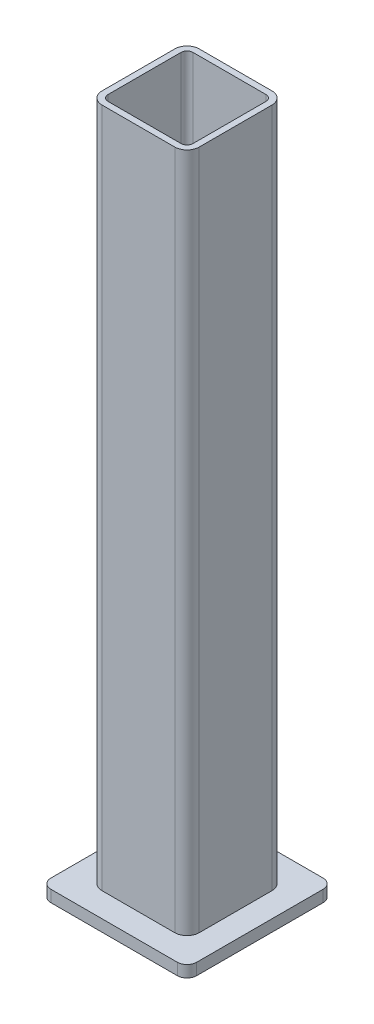
ISO-10303-21;
HEADER;
FILE_DESCRIPTION(('STEP AP214'),'2;1');
FILE_NAME('part.step','',(''),(''),'','','');
FILE_SCHEMA(('AUTOMOTIVE_DESIGN { 1 0 10303 214 1 1 1 1 }'));
ENDSEC;
DATA;
#1=APPLICATION_CONTEXT('core data for automotive mechanical design processes');
#2=APPLICATION_PROTOCOL_DEFINITION('international standard','automotive_design',2000,#1);
#3=PRODUCT_CONTEXT('',#1,'mechanical');
#4=PRODUCT('Part','Part','',(#3));
#5=PRODUCT_RELATED_PRODUCT_CATEGORY('part','',(#4));
#6=PRODUCT_DEFINITION_FORMATION('','',#4);
#7=PRODUCT_DEFINITION_CONTEXT('part definition',#1,'design');
#8=PRODUCT_DEFINITION('design','',#6,#7);
#9=PRODUCT_DEFINITION_SHAPE('','',#8);
#10=(LENGTH_UNIT() NAMED_UNIT(*) SI_UNIT(.MILLI.,.METRE.));
#11=(NAMED_UNIT(*) PLANE_ANGLE_UNIT() SI_UNIT($,.RADIAN.));
#12=(NAMED_UNIT(*) SI_UNIT($,.STERADIAN.) SOLID_ANGLE_UNIT());
#13=UNCERTAINTY_MEASURE_WITH_UNIT(LENGTH_MEASURE(1.E-05),#10,'distance_accuracy_value','');
#14=(GEOMETRIC_REPRESENTATION_CONTEXT(3) GLOBAL_UNCERTAINTY_ASSIGNED_CONTEXT((#13)) GLOBAL_UNIT_ASSIGNED_CONTEXT((#10,
#11,#12)) REPRESENTATION_CONTEXT('',''));
#15=CARTESIAN_POINT('',(0.,0.,0.));
#16=DIRECTION('',(0.,0.,1.));
#17=DIRECTION('',(1.,0.,0.));
#18=AXIS2_PLACEMENT_3D('',#15,#16,#17);
#19=CARTESIAN_POINT('',(75.,-12.,75.));
#20=DIRECTION('',(-1.,0.,0.));
#21=DIRECTION('',(0.,0.,1.));
#22=AXIS2_PLACEMENT_3D('',#19,#20,#21);
#23=PLANE('',#22);
#24=DIRECTION('',(0.,0.,1.));
#25=VECTOR('',#24,1.);
#26=CARTESIAN_POINT('',(75.,-12.,75.));
#27=LINE('',#26,#25);
#28=CARTESIAN_POINT('',(75.,-12.,-65.));
#29=VERTEX_POINT('',#28);
#30=CARTESIAN_POINT('',(75.,-12.,65.));
#31=VERTEX_POINT('',#30);
#32=EDGE_CURVE('E166',#29,#31,#27,.T.);
#33=ORIENTED_EDGE('',*,*,#32,.F.);
#34=DIRECTION('',(0.,1.,0.));
#35=VECTOR('',#34,1.);
#36=CARTESIAN_POINT('',(75.,-12.,-65.));
#37=LINE('',#36,#35);
#38=CARTESIAN_POINT('',(75.,0.,-65.));
#39=VERTEX_POINT('',#38);
#40=EDGE_CURVE('E192',#29,#39,#37,.T.);
#41=ORIENTED_EDGE('',*,*,#40,.T.);
#42=DIRECTION('',(0.,0.,1.));
#43=VECTOR('',#42,1.);
#44=CARTESIAN_POINT('',(75.,0.,75.));
#45=LINE('',#44,#43);
#46=CARTESIAN_POINT('',(75.,0.,65.));
#47=VERTEX_POINT('',#46);
#48=EDGE_CURVE('E198',#39,#47,#45,.T.);
#49=ORIENTED_EDGE('',*,*,#48,.T.);
#50=DIRECTION('',(0.,1.,0.));
#51=VECTOR('',#50,1.);
#52=CARTESIAN_POINT('',(75.,-12.,65.));
#53=LINE('',#52,#51);
#54=EDGE_CURVE('E190',#47,#31,#53,.F.);
#55=ORIENTED_EDGE('',*,*,#54,.T.);
#56=EDGE_LOOP('',(#33,#41,#49,#55));
#57=FACE_BOUND('',#56,.T.);
#58=ADVANCED_FACE('F74',(#57),#23,.F.);
#59=CARTESIAN_POINT('',(-75.,-12.,75.));
#60=DIRECTION('',(0.,0.,-1.));
#61=DIRECTION('',(-1.,0.,0.));
#62=AXIS2_PLACEMENT_3D('',#59,#60,#61);
#63=PLANE('',#62);
#64=DIRECTION('',(-1.,0.,0.));
#65=VECTOR('',#64,1.);
#66=CARTESIAN_POINT('',(-75.,-12.,75.));
#67=LINE('',#66,#65);
#68=CARTESIAN_POINT('',(65.,-12.,75.));
#69=VERTEX_POINT('',#68);
#70=CARTESIAN_POINT('',(-65.,-12.,75.));
#71=VERTEX_POINT('',#70);
#72=EDGE_CURVE('E169',#69,#71,#67,.T.);
#73=ORIENTED_EDGE('',*,*,#72,.F.);
#74=DIRECTION('',(0.,1.,0.));
#75=VECTOR('',#74,1.);
#76=CARTESIAN_POINT('',(65.,-12.,75.));
#77=LINE('',#76,#75);
#78=CARTESIAN_POINT('',(65.,0.,75.));
#79=VERTEX_POINT('',#78);
#80=EDGE_CURVE('E13',#69,#79,#77,.T.);
#81=ORIENTED_EDGE('',*,*,#80,.T.);
#82=DIRECTION('',(-1.,0.,0.));
#83=VECTOR('',#82,1.);
#84=CARTESIAN_POINT('',(-75.,0.,75.));
#85=LINE('',#84,#83);
#86=CARTESIAN_POINT('',(-65.,0.,75.));
#87=VERTEX_POINT('',#86);
#88=EDGE_CURVE('E171',#79,#87,#85,.T.);
#89=ORIENTED_EDGE('',*,*,#88,.T.);
#90=DIRECTION('',(0.,1.,0.));
#91=VECTOR('',#90,1.);
#92=CARTESIAN_POINT('',(-65.,-12.,75.));
#93=LINE('',#92,#91);
#94=EDGE_CURVE('E82',#87,#71,#93,.F.);
#95=ORIENTED_EDGE('',*,*,#94,.T.);
#96=EDGE_LOOP('',(#73,#81,#89,#95));
#97=FACE_BOUND('',#96,.T.);
#98=ADVANCED_FACE('F217',(#97),#63,.F.);
#99=CARTESIAN_POINT('',(-75.,-12.,75.));
#100=DIRECTION('',(1.,0.,0.));
#101=DIRECTION('',(0.,0.,-1.));
#102=AXIS2_PLACEMENT_3D('',#99,#100,#101);
#103=PLANE('',#102);
#104=DIRECTION('',(0.,0.,-1.));
#105=VECTOR('',#104,1.);
#106=CARTESIAN_POINT('',(-75.,0.,75.));
#107=LINE('',#106,#105);
#108=CARTESIAN_POINT('',(-75.,0.,65.));
#109=VERTEX_POINT('',#108);
#110=CARTESIAN_POINT('',(-75.,0.,-65.));
#111=VERTEX_POINT('',#110);
#112=EDGE_CURVE('E167',#109,#111,#107,.T.);
#113=ORIENTED_EDGE('',*,*,#112,.T.);
#114=DIRECTION('',(0.,1.,0.));
#115=VECTOR('',#114,1.);
#116=CARTESIAN_POINT('',(-75.,-12.,-65.));
#117=LINE('',#116,#115);
#118=CARTESIAN_POINT('',(-75.,-12.,-65.));
#119=VERTEX_POINT('',#118);
#120=EDGE_CURVE('E145',#111,#119,#117,.F.);
#121=ORIENTED_EDGE('',*,*,#120,.T.);
#122=DIRECTION('',(0.,0.,-1.));
#123=VECTOR('',#122,1.);
#124=CARTESIAN_POINT('',(-75.,-12.,75.));
#125=LINE('',#124,#123);
#126=CARTESIAN_POINT('',(-75.,-12.,65.));
#127=VERTEX_POINT('',#126);
#128=EDGE_CURVE('E206',#127,#119,#125,.T.);
#129=ORIENTED_EDGE('',*,*,#128,.F.);
#130=DIRECTION('',(0.,1.,0.));
#131=VECTOR('',#130,1.);
#132=CARTESIAN_POINT('',(-75.,-12.,65.));
#133=LINE('',#132,#131);
#134=EDGE_CURVE('E150',#127,#109,#133,.T.);
#135=ORIENTED_EDGE('',*,*,#134,.T.);
#136=EDGE_LOOP('',(#113,#121,#129,#135));
#137=FACE_BOUND('',#136,.T.);
#138=ADVANCED_FACE('F216',(#137),#103,.F.);
#139=CARTESIAN_POINT('',(-75.,-12.,-75.));
#140=DIRECTION('',(0.,0.,1.));
#141=DIRECTION('',(1.,0.,0.));
#142=AXIS2_PLACEMENT_3D('',#139,#140,#141);
#143=PLANE('',#142);
#144=DIRECTION('',(1.,0.,0.));
#145=VECTOR('',#144,1.);
#146=CARTESIAN_POINT('',(-75.,-12.,-75.));
#147=LINE('',#146,#145);
#148=CARTESIAN_POINT('',(-65.,-12.,-75.));
#149=VERTEX_POINT('',#148);
#150=CARTESIAN_POINT('',(65.,-12.,-75.));
#151=VERTEX_POINT('',#150);
#152=EDGE_CURVE('E160',#149,#151,#147,.T.);
#153=ORIENTED_EDGE('',*,*,#152,.F.);
#154=DIRECTION('',(0.,1.,0.));
#155=VECTOR('',#154,1.);
#156=CARTESIAN_POINT('',(-65.,-12.,-75.));
#157=LINE('',#156,#155);
#158=CARTESIAN_POINT('',(-65.,0.,-75.));
#159=VERTEX_POINT('',#158);
#160=EDGE_CURVE('E144',#149,#159,#157,.T.);
#161=ORIENTED_EDGE('',*,*,#160,.T.);
#162=DIRECTION('',(1.,0.,0.));
#163=VECTOR('',#162,1.);
#164=CARTESIAN_POINT('',(-75.,0.,-75.));
#165=LINE('',#164,#163);
#166=CARTESIAN_POINT('',(65.,0.,-75.));
#167=VERTEX_POINT('',#166);
#168=EDGE_CURVE('E157',#159,#167,#165,.T.);
#169=ORIENTED_EDGE('',*,*,#168,.T.);
#170=DIRECTION('',(0.,1.,0.));
#171=VECTOR('',#170,1.);
#172=CARTESIAN_POINT('',(65.,-12.,-75.));
#173=LINE('',#172,#171);
#174=EDGE_CURVE('E162',#167,#151,#173,.F.);
#175=ORIENTED_EDGE('',*,*,#174,.T.);
#176=EDGE_LOOP('',(#153,#161,#169,#175));
#177=FACE_BOUND('',#176,.T.);
#178=ADVANCED_FACE('F156',(#177),#143,.F.);
#179=CARTESIAN_POINT('',(0.,-12.,0.));
#180=DIRECTION('',(0.,-1.,0.));
#181=DIRECTION('',(0.,0.,-1.));
#182=AXIS2_PLACEMENT_3D('',#179,#180,#181);
#183=PLANE('',#182);
#184=ORIENTED_EDGE('',*,*,#128,.T.);
#185=CARTESIAN_POINT('',(-65.,-12.,-65.));
#186=DIRECTION('',(0.,-1.,0.));
#187=DIRECTION('',(0.,0.,-1.));
#188=AXIS2_PLACEMENT_3D('',#185,#186,#187);
#189=CIRCLE('',#188,10.);
#190=EDGE_CURVE('E188',#119,#149,#189,.T.);
#191=ORIENTED_EDGE('',*,*,#190,.T.);
#192=ORIENTED_EDGE('',*,*,#152,.T.);
#193=CARTESIAN_POINT('',(65.,-12.,-65.));
#194=DIRECTION('',(0.,-1.,0.));
#195=DIRECTION('',(0.,0.,-1.));
#196=AXIS2_PLACEMENT_3D('',#193,#194,#195);
#197=CIRCLE('',#196,10.);
#198=EDGE_CURVE('E186',#151,#29,#197,.T.);
#199=ORIENTED_EDGE('',*,*,#198,.T.);
#200=ORIENTED_EDGE('',*,*,#32,.T.);
#201=CARTESIAN_POINT('',(65.,-12.,65.));
#202=DIRECTION('',(0.,-1.,0.));
#203=DIRECTION('',(0.,0.,-1.));
#204=AXIS2_PLACEMENT_3D('',#201,#202,#203);
#205=CIRCLE('',#204,10.);
#206=EDGE_CURVE('E95',#31,#69,#205,.T.);
#207=ORIENTED_EDGE('',*,*,#206,.T.);
#208=ORIENTED_EDGE('',*,*,#72,.T.);
#209=CARTESIAN_POINT('',(-65.,-12.,65.));
#210=DIRECTION('',(0.,-1.,0.));
#211=DIRECTION('',(0.,0.,-1.));
#212=AXIS2_PLACEMENT_3D('',#209,#210,#211);
#213=CIRCLE('',#212,10.);
#214=EDGE_CURVE('E183',#71,#127,#213,.T.);
#215=ORIENTED_EDGE('',*,*,#214,.T.);
#216=EDGE_LOOP('',(#184,#191,#192,#199,#200,#207,#208,#215));
#217=FACE_BOUND('',#216,.T.);
#218=ADVANCED_FACE('F210',(#217),#183,.T.);
#219=CARTESIAN_POINT('',(0.,0.,0.));
#220=DIRECTION('',(0.,-1.,0.));
#221=DIRECTION('',(0.,0.,-1.));
#222=AXIS2_PLACEMENT_3D('',#219,#220,#221);
#223=PLANE('',#222);
#224=ORIENTED_EDGE('',*,*,#168,.F.);
#225=CARTESIAN_POINT('',(-65.,0.,-65.));
#226=DIRECTION('',(0.,-1.,0.));
#227=DIRECTION('',(0.,0.,-1.));
#228=AXIS2_PLACEMENT_3D('',#225,#226,#227);
#229=CIRCLE('',#228,10.);
#230=EDGE_CURVE('E140',#159,#111,#229,.F.);
#231=ORIENTED_EDGE('',*,*,#230,.T.);
#232=ORIENTED_EDGE('',*,*,#112,.F.);
#233=CARTESIAN_POINT('',(-65.,0.,65.));
#234=DIRECTION('',(0.,-1.,0.));
#235=DIRECTION('',(0.,0.,-1.));
#236=AXIS2_PLACEMENT_3D('',#233,#234,#235);
#237=CIRCLE('',#236,10.);
#238=EDGE_CURVE('E161',#109,#87,#237,.F.);
#239=ORIENTED_EDGE('',*,*,#238,.T.);
#240=ORIENTED_EDGE('',*,*,#88,.F.);
#241=CARTESIAN_POINT('',(65.,0.,65.));
#242=DIRECTION('',(0.,-1.,0.));
#243=DIRECTION('',(0.,0.,-1.));
#244=AXIS2_PLACEMENT_3D('',#241,#242,#243);
#245=CIRCLE('',#244,10.);
#246=EDGE_CURVE('E177',#79,#47,#245,.F.);
#247=ORIENTED_EDGE('',*,*,#246,.T.);
#248=ORIENTED_EDGE('',*,*,#48,.F.);
#249=CARTESIAN_POINT('',(65.,0.,-65.));
#250=DIRECTION('',(0.,-1.,0.));
#251=DIRECTION('',(0.,0.,-1.));
#252=AXIS2_PLACEMENT_3D('',#249,#250,#251);
#253=CIRCLE('',#252,10.);
#254=EDGE_CURVE('E151',#39,#167,#253,.F.);
#255=ORIENTED_EDGE('',*,*,#254,.T.);
#256=EDGE_LOOP('',(#224,#231,#232,#239,#240,#247,#248,#255));
#257=FACE_BOUND('',#256,.T.);
#258=ADVANCED_FACE('F164',(#257),#223,.F.);
#259=CARTESIAN_POINT('',(-65.,-12.,-65.));
#260=DIRECTION('',(0.,1.,0.));
#261=DIRECTION('',(0.,0.,1.));
#262=AXIS2_PLACEMENT_3D('',#259,#260,#261);
#263=CYLINDRICAL_SURFACE('',#262,10.);
#264=ORIENTED_EDGE('',*,*,#190,.F.);
#265=ORIENTED_EDGE('',*,*,#120,.F.);
#266=ORIENTED_EDGE('',*,*,#230,.F.);
#267=ORIENTED_EDGE('',*,*,#160,.F.);
#268=EDGE_LOOP('',(#264,#265,#266,#267));
#269=FACE_BOUND('',#268,.T.);
#270=ADVANCED_FACE('F143',(#269),#263,.T.);
#271=CARTESIAN_POINT('',(65.,-12.,-65.));
#272=DIRECTION('',(0.,1.,0.));
#273=DIRECTION('',(0.,0.,1.));
#274=AXIS2_PLACEMENT_3D('',#271,#272,#273);
#275=CYLINDRICAL_SURFACE('',#274,10.);
#276=ORIENTED_EDGE('',*,*,#198,.F.);
#277=ORIENTED_EDGE('',*,*,#174,.F.);
#278=ORIENTED_EDGE('',*,*,#254,.F.);
#279=ORIENTED_EDGE('',*,*,#40,.F.);
#280=EDGE_LOOP('',(#276,#277,#278,#279));
#281=FACE_BOUND('',#280,.T.);
#282=ADVANCED_FACE('F220',(#281),#275,.T.);
#283=CARTESIAN_POINT('',(65.,-12.,65.));
#284=DIRECTION('',(0.,1.,0.));
#285=DIRECTION('',(0.,0.,1.));
#286=AXIS2_PLACEMENT_3D('',#283,#284,#285);
#287=CYLINDRICAL_SURFACE('',#286,10.);
#288=ORIENTED_EDGE('',*,*,#206,.F.);
#289=ORIENTED_EDGE('',*,*,#54,.F.);
#290=ORIENTED_EDGE('',*,*,#246,.F.);
#291=ORIENTED_EDGE('',*,*,#80,.F.);
#292=EDGE_LOOP('',(#288,#289,#290,#291));
#293=FACE_BOUND('',#292,.T.);
#294=ADVANCED_FACE('F219',(#293),#287,.T.);
#295=CARTESIAN_POINT('',(-65.,-12.,65.));
#296=DIRECTION('',(0.,1.,0.));
#297=DIRECTION('',(0.,0.,1.));
#298=AXIS2_PLACEMENT_3D('',#295,#296,#297);
#299=CYLINDRICAL_SURFACE('',#298,10.);
#300=ORIENTED_EDGE('',*,*,#214,.F.);
#301=ORIENTED_EDGE('',*,*,#94,.F.);
#302=ORIENTED_EDGE('',*,*,#238,.F.);
#303=ORIENTED_EDGE('',*,*,#134,.F.);
#304=EDGE_LOOP('',(#300,#301,#302,#303));
#305=FACE_BOUND('',#304,.T.);
#306=ADVANCED_FACE('F76',(#305),#299,.T.);
#307=CLOSED_SHELL('',(#58,#98,#138,#178,#218,#258,#270,#282,#294,#306));
#308=MANIFOLD_SOLID_BREP('B2',#307);
#309=CARTESIAN_POINT('',(-37.4,700.,37.4));
#310=DIRECTION('',(0.,-1.,0.));
#311=DIRECTION('',(0.,0.,-1.));
#312=AXIS2_PLACEMENT_3D('',#309,#310,#311);
#313=CYLINDRICAL_SURFACE('',#312,12.6);
#314=CARTESIAN_POINT('',(-37.4,0.,37.4));
#315=DIRECTION('',(0.,1.,0.));
#316=DIRECTION('',(0.,0.,1.));
#317=AXIS2_PLACEMENT_3D('',#314,#315,#316);
#318=CIRCLE('',#317,12.6);
#319=CARTESIAN_POINT('',(-50.,0.,37.4));
#320=VERTEX_POINT('',#319);
#321=CARTESIAN_POINT('',(-37.4,0.,50.));
#322=VERTEX_POINT('',#321);
#323=EDGE_CURVE('E493',#320,#322,#318,.T.);
#324=ORIENTED_EDGE('',*,*,#323,.T.);
#325=DIRECTION('',(0.,-1.,0.));
#326=VECTOR('',#325,1.);
#327=CARTESIAN_POINT('',(-37.4,700.,50.));
#328=LINE('',#327,#326);
#329=CARTESIAN_POINT('',(-37.4,700.,50.));
#330=VERTEX_POINT('',#329);
#331=EDGE_CURVE('E72',#330,#322,#328,.T.);
#332=ORIENTED_EDGE('',*,*,#331,.F.);
#333=CARTESIAN_POINT('',(-37.4,700.,37.4));
#334=DIRECTION('',(0.,1.,0.));
#335=DIRECTION('',(0.,0.,1.));
#336=AXIS2_PLACEMENT_3D('',#333,#334,#335);
#337=CIRCLE('',#336,12.6);
#338=CARTESIAN_POINT('',(-50.,700.,37.4));
#339=VERTEX_POINT('',#338);
#340=EDGE_CURVE('E571',#339,#330,#337,.T.);
#341=ORIENTED_EDGE('',*,*,#340,.F.);
#342=DIRECTION('',(0.,-1.,0.));
#343=VECTOR('',#342,1.);
#344=CARTESIAN_POINT('',(-50.,700.,37.4));
#345=LINE('',#344,#343);
#346=EDGE_CURVE('E508',#339,#320,#345,.T.);
#347=ORIENTED_EDGE('',*,*,#346,.T.);
#348=EDGE_LOOP('',(#324,#332,#341,#347));
#349=FACE_BOUND('',#348,.T.);
#350=ADVANCED_FACE('F321',(#349),#313,.T.);
#351=CARTESIAN_POINT('',(-37.4,700.,50.));
#352=DIRECTION('',(0.,0.,-1.));
#353=DIRECTION('',(-1.,0.,0.));
#354=AXIS2_PLACEMENT_3D('',#351,#352,#353);
#355=PLANE('',#354);
#356=DIRECTION('',(1.,0.,0.));
#357=VECTOR('',#356,1.);
#358=CARTESIAN_POINT('',(-37.4,0.,50.));
#359=LINE('',#358,#357);
#360=CARTESIAN_POINT('',(37.4,0.,50.));
#361=VERTEX_POINT('',#360);
#362=EDGE_CURVE('E496',#322,#361,#359,.T.);
#363=ORIENTED_EDGE('',*,*,#362,.T.);
#364=DIRECTION('',(0.,-1.,0.));
#365=VECTOR('',#364,1.);
#366=CARTESIAN_POINT('',(37.4,700.,50.));
#367=LINE('',#366,#365);
#368=CARTESIAN_POINT('',(37.4,700.,50.));
#369=VERTEX_POINT('',#368);
#370=EDGE_CURVE('E331',#369,#361,#367,.T.);
#371=ORIENTED_EDGE('',*,*,#370,.F.);
#372=DIRECTION('',(1.,0.,0.));
#373=VECTOR('',#372,1.);
#374=CARTESIAN_POINT('',(-37.4,700.,50.));
#375=LINE('',#374,#373);
#376=EDGE_CURVE('E573',#330,#369,#375,.T.);
#377=ORIENTED_EDGE('',*,*,#376,.F.);
#378=ORIENTED_EDGE('',*,*,#331,.T.);
#379=EDGE_LOOP('',(#363,#371,#377,#378));
#380=FACE_BOUND('',#379,.T.);
#381=ADVANCED_FACE('F608',(#380),#355,.F.);
#382=CARTESIAN_POINT('',(37.4,700.,37.4));
#383=DIRECTION('',(0.,-1.,0.));
#384=DIRECTION('',(0.,0.,-1.));
#385=AXIS2_PLACEMENT_3D('',#382,#383,#384);
#386=CYLINDRICAL_SURFACE('',#385,12.6);
#387=CARTESIAN_POINT('',(37.4,0.,37.4));
#388=DIRECTION('',(0.,1.,0.));
#389=DIRECTION('',(0.,0.,1.));
#390=AXIS2_PLACEMENT_3D('',#387,#388,#389);
#391=CIRCLE('',#390,12.6);
#392=CARTESIAN_POINT('',(50.,0.,37.4));
#393=VERTEX_POINT('',#392);
#394=EDGE_CURVE('E498',#361,#393,#391,.T.);
#395=ORIENTED_EDGE('',*,*,#394,.T.);
#396=DIRECTION('',(0.,-1.,0.));
#397=VECTOR('',#396,1.);
#398=CARTESIAN_POINT('',(50.,700.,37.4));
#399=LINE('',#398,#397);
#400=CARTESIAN_POINT('',(50.,700.,37.4));
#401=VERTEX_POINT('',#400);
#402=EDGE_CURVE('E515',#401,#393,#399,.T.);
#403=ORIENTED_EDGE('',*,*,#402,.F.);
#404=CARTESIAN_POINT('',(37.4,700.,37.4));
#405=DIRECTION('',(0.,1.,0.));
#406=DIRECTION('',(0.,0.,1.));
#407=AXIS2_PLACEMENT_3D('',#404,#405,#406);
#408=CIRCLE('',#407,12.6);
#409=EDGE_CURVE('E575',#369,#401,#408,.T.);
#410=ORIENTED_EDGE('',*,*,#409,.F.);
#411=ORIENTED_EDGE('',*,*,#370,.T.);
#412=EDGE_LOOP('',(#395,#403,#410,#411));
#413=FACE_BOUND('',#412,.T.);
#414=ADVANCED_FACE('F613',(#413),#386,.T.);
#415=CARTESIAN_POINT('',(50.,700.,-37.4));
#416=DIRECTION('',(-1.,0.,0.));
#417=DIRECTION('',(0.,0.,1.));
#418=AXIS2_PLACEMENT_3D('',#415,#416,#417);
#419=PLANE('',#418);
#420=DIRECTION('',(0.,0.,-1.));
#421=VECTOR('',#420,1.);
#422=CARTESIAN_POINT('',(50.,0.,-37.4));
#423=LINE('',#422,#421);
#424=CARTESIAN_POINT('',(50.,0.,-37.4));
#425=VERTEX_POINT('',#424);
#426=EDGE_CURVE('E500',#393,#425,#423,.T.);
#427=ORIENTED_EDGE('',*,*,#426,.T.);
#428=DIRECTION('',(0.,-1.,0.));
#429=VECTOR('',#428,1.);
#430=CARTESIAN_POINT('',(50.,700.,-37.4));
#431=LINE('',#430,#429);
#432=CARTESIAN_POINT('',(50.,700.,-37.4));
#433=VERTEX_POINT('',#432);
#434=EDGE_CURVE('E512',#433,#425,#431,.T.);
#435=ORIENTED_EDGE('',*,*,#434,.F.);
#436=DIRECTION('',(0.,0.,-1.));
#437=VECTOR('',#436,1.);
#438=CARTESIAN_POINT('',(50.,700.,-37.4));
#439=LINE('',#438,#437);
#440=EDGE_CURVE('E577',#401,#433,#439,.T.);
#441=ORIENTED_EDGE('',*,*,#440,.F.);
#442=ORIENTED_EDGE('',*,*,#402,.T.);
#443=EDGE_LOOP('',(#427,#435,#441,#442));
#444=FACE_BOUND('',#443,.T.);
#445=ADVANCED_FACE('F583',(#444),#419,.F.);
#446=CARTESIAN_POINT('',(37.4,700.,-37.4));
#447=DIRECTION('',(0.,-1.,0.));
#448=DIRECTION('',(0.,0.,-1.));
#449=AXIS2_PLACEMENT_3D('',#446,#447,#448);
#450=CYLINDRICAL_SURFACE('',#449,12.6);
#451=CARTESIAN_POINT('',(37.4,0.,-37.4));
#452=DIRECTION('',(0.,1.,0.));
#453=DIRECTION('',(0.,0.,1.));
#454=AXIS2_PLACEMENT_3D('',#451,#452,#453);
#455=CIRCLE('',#454,12.6);
#456=CARTESIAN_POINT('',(37.4,0.,-50.));
#457=VERTEX_POINT('',#456);
#458=EDGE_CURVE('E502',#425,#457,#455,.T.);
#459=ORIENTED_EDGE('',*,*,#458,.T.);
#460=DIRECTION('',(0.,-1.,0.));
#461=VECTOR('',#460,1.);
#462=CARTESIAN_POINT('',(37.4,700.,-50.));
#463=LINE('',#462,#461);
#464=CARTESIAN_POINT('',(37.4,700.,-50.));
#465=VERTEX_POINT('',#464);
#466=EDGE_CURVE('E460',#465,#457,#463,.T.);
#467=ORIENTED_EDGE('',*,*,#466,.F.);
#468=CARTESIAN_POINT('',(37.4,700.,-37.4));
#469=DIRECTION('',(0.,1.,0.));
#470=DIRECTION('',(0.,0.,1.));
#471=AXIS2_PLACEMENT_3D('',#468,#469,#470);
#472=CIRCLE('',#471,12.6);
#473=EDGE_CURVE('E451',#433,#465,#472,.T.);
#474=ORIENTED_EDGE('',*,*,#473,.F.);
#475=ORIENTED_EDGE('',*,*,#434,.T.);
#476=EDGE_LOOP('',(#459,#467,#474,#475));
#477=FACE_BOUND('',#476,.T.);
#478=ADVANCED_FACE('F587',(#477),#450,.T.);
#479=CARTESIAN_POINT('',(37.4,700.,-50.));
#480=DIRECTION('',(0.,0.,1.));
#481=DIRECTION('',(1.,0.,0.));
#482=AXIS2_PLACEMENT_3D('',#479,#480,#481);
#483=PLANE('',#482);
#484=DIRECTION('',(-1.,0.,0.));
#485=VECTOR('',#484,1.);
#486=CARTESIAN_POINT('',(37.4,0.,-50.));
#487=LINE('',#486,#485);
#488=CARTESIAN_POINT('',(-37.4,0.,-50.));
#489=VERTEX_POINT('',#488);
#490=EDGE_CURVE('E459',#457,#489,#487,.T.);
#491=ORIENTED_EDGE('',*,*,#490,.T.);
#492=DIRECTION('',(0.,-1.,0.));
#493=VECTOR('',#492,1.);
#494=CARTESIAN_POINT('',(-37.4,700.,-50.));
#495=LINE('',#494,#493);
#496=CARTESIAN_POINT('',(-37.4,700.,-50.));
#497=VERTEX_POINT('',#496);
#498=EDGE_CURVE('E456',#497,#489,#495,.T.);
#499=ORIENTED_EDGE('',*,*,#498,.F.);
#500=DIRECTION('',(-1.,0.,0.));
#501=VECTOR('',#500,1.);
#502=CARTESIAN_POINT('',(37.4,700.,-50.));
#503=LINE('',#502,#501);
#504=EDGE_CURVE('E445',#465,#497,#503,.T.);
#505=ORIENTED_EDGE('',*,*,#504,.F.);
#506=ORIENTED_EDGE('',*,*,#466,.T.);
#507=EDGE_LOOP('',(#491,#499,#505,#506));
#508=FACE_BOUND('',#507,.T.);
#509=ADVANCED_FACE('F457',(#508),#483,.F.);
#510=CARTESIAN_POINT('',(-37.4,700.,-37.4));
#511=DIRECTION('',(0.,-1.,0.));
#512=DIRECTION('',(0.,0.,-1.));
#513=AXIS2_PLACEMENT_3D('',#510,#511,#512);
#514=CYLINDRICAL_SURFACE('',#513,12.6);
#515=CARTESIAN_POINT('',(-37.4,0.,-37.4));
#516=DIRECTION('',(0.,1.,0.));
#517=DIRECTION('',(0.,0.,1.));
#518=AXIS2_PLACEMENT_3D('',#515,#516,#517);
#519=CIRCLE('',#518,12.6);
#520=CARTESIAN_POINT('',(-50.,0.,-37.4));
#521=VERTEX_POINT('',#520);
#522=EDGE_CURVE('E393',#489,#521,#519,.T.);
#523=ORIENTED_EDGE('',*,*,#522,.T.);
#524=DIRECTION('',(0.,-1.,0.));
#525=VECTOR('',#524,1.);
#526=CARTESIAN_POINT('',(-50.,700.,-37.4));
#527=LINE('',#526,#525);
#528=CARTESIAN_POINT('',(-50.,700.,-37.4));
#529=VERTEX_POINT('',#528);
#530=EDGE_CURVE('E461',#529,#521,#527,.T.);
#531=ORIENTED_EDGE('',*,*,#530,.F.);
#532=CARTESIAN_POINT('',(-37.4,700.,-37.4));
#533=DIRECTION('',(0.,1.,0.));
#534=DIRECTION('',(0.,0.,1.));
#535=AXIS2_PLACEMENT_3D('',#532,#533,#534);
#536=CIRCLE('',#535,12.6);
#537=EDGE_CURVE('E449',#497,#529,#536,.T.);
#538=ORIENTED_EDGE('',*,*,#537,.F.);
#539=ORIENTED_EDGE('',*,*,#498,.T.);
#540=EDGE_LOOP('',(#523,#531,#538,#539));
#541=FACE_BOUND('',#540,.T.);
#542=ADVANCED_FACE('F463',(#541),#514,.T.);
#543=CARTESIAN_POINT('',(37.4,700.,37.4));
#544=DIRECTION('',(0.,-1.,0.));
#545=DIRECTION('',(0.,0.,-1.));
#546=AXIS2_PLACEMENT_3D('',#543,#544,#545);
#547=CYLINDRICAL_SURFACE('',#546,6.30000000000001);
#548=CARTESIAN_POINT('',(37.4,0.,37.4));
#549=DIRECTION('',(0.,1.,0.));
#550=DIRECTION('',(0.,0.,1.));
#551=AXIS2_PLACEMENT_3D('',#548,#549,#550);
#552=CIRCLE('',#551,6.30000000000001);
#553=CARTESIAN_POINT('',(37.4,0.,43.7));
#554=VERTEX_POINT('',#553);
#555=CARTESIAN_POINT('',(43.7,0.,37.4));
#556=VERTEX_POINT('',#555);
#557=EDGE_CURVE('E469',#554,#556,#552,.T.);
#558=ORIENTED_EDGE('',*,*,#557,.F.);
#559=DIRECTION('',(0.,-1.,0.));
#560=VECTOR('',#559,1.);
#561=CARTESIAN_POINT('',(37.4,700.,43.7));
#562=LINE('',#561,#560);
#563=CARTESIAN_POINT('',(37.4,700.,43.7));
#564=VERTEX_POINT('',#563);
#565=EDGE_CURVE('E325',#564,#554,#562,.T.);
#566=ORIENTED_EDGE('',*,*,#565,.F.);
#567=CARTESIAN_POINT('',(37.4,700.,37.4));
#568=DIRECTION('',(0.,1.,0.));
#569=DIRECTION('',(0.,0.,1.));
#570=AXIS2_PLACEMENT_3D('',#567,#568,#569);
#571=CIRCLE('',#570,6.30000000000001);
#572=CARTESIAN_POINT('',(43.7,700.,37.4));
#573=VERTEX_POINT('',#572);
#574=EDGE_CURVE('E507',#564,#573,#571,.T.);
#575=ORIENTED_EDGE('',*,*,#574,.T.);
#576=DIRECTION('',(0.,-1.,0.));
#577=VECTOR('',#576,1.);
#578=CARTESIAN_POINT('',(43.7,700.,37.4));
#579=LINE('',#578,#577);
#580=EDGE_CURVE('E465',#573,#556,#579,.T.);
#581=ORIENTED_EDGE('',*,*,#580,.T.);
#582=EDGE_LOOP('',(#558,#566,#575,#581));
#583=FACE_BOUND('',#582,.T.);
#584=ADVANCED_FACE('F323',(#583),#547,.F.);
#585=CARTESIAN_POINT('',(-37.4,700.,43.7));
#586=DIRECTION('',(0.,0.,-1.));
#587=DIRECTION('',(-1.,0.,0.));
#588=AXIS2_PLACEMENT_3D('',#585,#586,#587);
#589=PLANE('',#588);
#590=DIRECTION('',(1.,0.,0.));
#591=VECTOR('',#590,1.);
#592=CARTESIAN_POINT('',(-37.4,0.,43.7));
#593=LINE('',#592,#591);
#594=CARTESIAN_POINT('',(-37.4,0.,43.7));
#595=VERTEX_POINT('',#594);
#596=EDGE_CURVE('E472',#595,#554,#593,.T.);
#597=ORIENTED_EDGE('',*,*,#596,.F.);
#598=DIRECTION('',(0.,-1.,0.));
#599=VECTOR('',#598,1.);
#600=CARTESIAN_POINT('',(-37.4,700.,43.7));
#601=LINE('',#600,#599);
#602=CARTESIAN_POINT('',(-37.4,700.,43.7));
#603=VERTEX_POINT('',#602);
#604=EDGE_CURVE('E530',#603,#595,#601,.T.);
#605=ORIENTED_EDGE('',*,*,#604,.F.);
#606=DIRECTION('',(1.,0.,0.));
#607=VECTOR('',#606,1.);
#608=CARTESIAN_POINT('',(-37.4,700.,43.7));
#609=LINE('',#608,#607);
#610=EDGE_CURVE('E539',#603,#564,#609,.T.);
#611=ORIENTED_EDGE('',*,*,#610,.T.);
#612=ORIENTED_EDGE('',*,*,#565,.T.);
#613=EDGE_LOOP('',(#597,#605,#611,#612));
#614=FACE_BOUND('',#613,.T.);
#615=ADVANCED_FACE('F537',(#614),#589,.T.);
#616=CARTESIAN_POINT('',(-37.4,700.,37.4));
#617=DIRECTION('',(0.,-1.,0.));
#618=DIRECTION('',(0.,0.,-1.));
#619=AXIS2_PLACEMENT_3D('',#616,#617,#618);
#620=CYLINDRICAL_SURFACE('',#619,6.30000000000001);
#621=CARTESIAN_POINT('',(-37.4,0.,37.4));
#622=DIRECTION('',(0.,1.,0.));
#623=DIRECTION('',(0.,0.,1.));
#624=AXIS2_PLACEMENT_3D('',#621,#622,#623);
#625=CIRCLE('',#624,6.30000000000001);
#626=CARTESIAN_POINT('',(-43.7,0.,37.4));
#627=VERTEX_POINT('',#626);
#628=EDGE_CURVE('E475',#627,#595,#625,.T.);
#629=ORIENTED_EDGE('',*,*,#628,.F.);
#630=DIRECTION('',(0.,-1.,0.));
#631=VECTOR('',#630,1.);
#632=CARTESIAN_POINT('',(-43.7,700.,37.4));
#633=LINE('',#632,#631);
#634=CARTESIAN_POINT('',(-43.7,700.,37.4));
#635=VERTEX_POINT('',#634);
#636=EDGE_CURVE('E529',#635,#627,#633,.T.);
#637=ORIENTED_EDGE('',*,*,#636,.F.);
#638=CARTESIAN_POINT('',(-37.4,700.,37.4));
#639=DIRECTION('',(0.,1.,0.));
#640=DIRECTION('',(0.,0.,1.));
#641=AXIS2_PLACEMENT_3D('',#638,#639,#640);
#642=CIRCLE('',#641,6.30000000000001);
#643=EDGE_CURVE('E547',#635,#603,#642,.T.);
#644=ORIENTED_EDGE('',*,*,#643,.T.);
#645=ORIENTED_EDGE('',*,*,#604,.T.);
#646=EDGE_LOOP('',(#629,#637,#644,#645));
#647=FACE_BOUND('',#646,.T.);
#648=ADVANCED_FACE('F545',(#647),#620,.F.);
#649=CARTESIAN_POINT('',(-43.7,700.,37.4));
#650=DIRECTION('',(1.,0.,0.));
#651=DIRECTION('',(0.,0.,-1.));
#652=AXIS2_PLACEMENT_3D('',#649,#650,#651);
#653=PLANE('',#652);
#654=DIRECTION('',(0.,0.,1.));
#655=VECTOR('',#654,1.);
#656=CARTESIAN_POINT('',(-43.7,0.,37.4));
#657=LINE('',#656,#655);
#658=CARTESIAN_POINT('',(-43.7,0.,-37.4));
#659=VERTEX_POINT('',#658);
#660=EDGE_CURVE('E478',#659,#627,#657,.T.);
#661=ORIENTED_EDGE('',*,*,#660,.F.);
#662=DIRECTION('',(0.,-1.,0.));
#663=VECTOR('',#662,1.);
#664=CARTESIAN_POINT('',(-43.7,700.,-37.4));
#665=LINE('',#664,#663);
#666=CARTESIAN_POINT('',(-43.7,700.,-37.4));
#667=VERTEX_POINT('',#666);
#668=EDGE_CURVE('E527',#667,#659,#665,.T.);
#669=ORIENTED_EDGE('',*,*,#668,.F.);
#670=DIRECTION('',(0.,0.,1.));
#671=VECTOR('',#670,1.);
#672=CARTESIAN_POINT('',(-43.7,700.,37.4));
#673=LINE('',#672,#671);
#674=EDGE_CURVE('E553',#667,#635,#673,.T.);
#675=ORIENTED_EDGE('',*,*,#674,.T.);
#676=ORIENTED_EDGE('',*,*,#636,.T.);
#677=EDGE_LOOP('',(#661,#669,#675,#676));
#678=FACE_BOUND('',#677,.T.);
#679=ADVANCED_FACE('F556',(#678),#653,.T.);
#680=CARTESIAN_POINT('',(-37.4,700.,-37.4));
#681=DIRECTION('',(0.,-1.,0.));
#682=DIRECTION('',(0.,0.,-1.));
#683=AXIS2_PLACEMENT_3D('',#680,#681,#682);
#684=CYLINDRICAL_SURFACE('',#683,6.30000000000001);
#685=CARTESIAN_POINT('',(-37.4,0.,-37.4));
#686=DIRECTION('',(0.,1.,0.));
#687=DIRECTION('',(0.,0.,1.));
#688=AXIS2_PLACEMENT_3D('',#685,#686,#687);
#689=CIRCLE('',#688,6.30000000000001);
#690=CARTESIAN_POINT('',(-37.4,0.,-43.7));
#691=VERTEX_POINT('',#690);
#692=EDGE_CURVE('E481',#691,#659,#689,.T.);
#693=ORIENTED_EDGE('',*,*,#692,.F.);
#694=DIRECTION('',(0.,-1.,0.));
#695=VECTOR('',#694,1.);
#696=CARTESIAN_POINT('',(-37.4,700.,-43.7));
#697=LINE('',#696,#695);
#698=CARTESIAN_POINT('',(-37.4,700.,-43.7));
#699=VERTEX_POINT('',#698);
#700=EDGE_CURVE('E525',#699,#691,#697,.T.);
#701=ORIENTED_EDGE('',*,*,#700,.F.);
#702=CARTESIAN_POINT('',(-37.4,700.,-37.4));
#703=DIRECTION('',(0.,1.,0.));
#704=DIRECTION('',(0.,0.,1.));
#705=AXIS2_PLACEMENT_3D('',#702,#703,#704);
#706=CIRCLE('',#705,6.30000000000001);
#707=EDGE_CURVE('E557',#699,#667,#706,.T.);
#708=ORIENTED_EDGE('',*,*,#707,.T.);
#709=ORIENTED_EDGE('',*,*,#668,.T.);
#710=EDGE_LOOP('',(#693,#701,#708,#709));
#711=FACE_BOUND('',#710,.T.);
#712=ADVANCED_FACE('F624',(#711),#684,.F.);
#713=CARTESIAN_POINT('',(37.4,700.,-43.7));
#714=DIRECTION('',(0.,0.,1.));
#715=DIRECTION('',(1.,0.,0.));
#716=AXIS2_PLACEMENT_3D('',#713,#714,#715);
#717=PLANE('',#716);
#718=DIRECTION('',(-1.,0.,0.));
#719=VECTOR('',#718,1.);
#720=CARTESIAN_POINT('',(37.4,0.,-43.7));
#721=LINE('',#720,#719);
#722=CARTESIAN_POINT('',(37.4,0.,-43.7));
#723=VERTEX_POINT('',#722);
#724=EDGE_CURVE('E484',#723,#691,#721,.T.);
#725=ORIENTED_EDGE('',*,*,#724,.F.);
#726=DIRECTION('',(0.,-1.,0.));
#727=VECTOR('',#726,1.);
#728=CARTESIAN_POINT('',(37.4,700.,-43.7));
#729=LINE('',#728,#727);
#730=CARTESIAN_POINT('',(37.4,700.,-43.7));
#731=VERTEX_POINT('',#730);
#732=EDGE_CURVE('E523',#731,#723,#729,.T.);
#733=ORIENTED_EDGE('',*,*,#732,.F.);
#734=DIRECTION('',(-1.,0.,0.));
#735=VECTOR('',#734,1.);
#736=CARTESIAN_POINT('',(37.4,700.,-43.7));
#737=LINE('',#736,#735);
#738=EDGE_CURVE('E559',#731,#699,#737,.T.);
#739=ORIENTED_EDGE('',*,*,#738,.T.);
#740=ORIENTED_EDGE('',*,*,#700,.T.);
#741=EDGE_LOOP('',(#725,#733,#739,#740));
#742=FACE_BOUND('',#741,.T.);
#743=ADVANCED_FACE('F620',(#742),#717,.T.);
#744=CARTESIAN_POINT('',(37.4,700.,-37.4));
#745=DIRECTION('',(0.,-1.,0.));
#746=DIRECTION('',(0.,0.,-1.));
#747=AXIS2_PLACEMENT_3D('',#744,#745,#746);
#748=CYLINDRICAL_SURFACE('',#747,6.3);
#749=CARTESIAN_POINT('',(37.4,0.,-37.4));
#750=DIRECTION('',(0.,1.,0.));
#751=DIRECTION('',(0.,0.,1.));
#752=AXIS2_PLACEMENT_3D('',#749,#750,#751);
#753=CIRCLE('',#752,6.3);
#754=CARTESIAN_POINT('',(43.7,0.,-37.4));
#755=VERTEX_POINT('',#754);
#756=EDGE_CURVE('E487',#755,#723,#753,.T.);
#757=ORIENTED_EDGE('',*,*,#756,.F.);
#758=DIRECTION('',(0.,-1.,0.));
#759=VECTOR('',#758,1.);
#760=CARTESIAN_POINT('',(43.7,700.,-37.4));
#761=LINE('',#760,#759);
#762=CARTESIAN_POINT('',(43.7,700.,-37.4));
#763=VERTEX_POINT('',#762);
#764=EDGE_CURVE('E521',#763,#755,#761,.T.);
#765=ORIENTED_EDGE('',*,*,#764,.F.);
#766=CARTESIAN_POINT('',(37.4,700.,-37.4));
#767=DIRECTION('',(0.,1.,0.));
#768=DIRECTION('',(0.,0.,1.));
#769=AXIS2_PLACEMENT_3D('',#766,#767,#768);
#770=CIRCLE('',#769,6.3);
#771=EDGE_CURVE('E565',#763,#731,#770,.T.);
#772=ORIENTED_EDGE('',*,*,#771,.T.);
#773=ORIENTED_EDGE('',*,*,#732,.T.);
#774=EDGE_LOOP('',(#757,#765,#772,#773));
#775=FACE_BOUND('',#774,.T.);
#776=ADVANCED_FACE('F602',(#775),#748,.F.);
#777=CARTESIAN_POINT('',(43.7,700.,-37.4));
#778=DIRECTION('',(-1.,0.,0.));
#779=DIRECTION('',(0.,0.,1.));
#780=AXIS2_PLACEMENT_3D('',#777,#778,#779);
#781=PLANE('',#780);
#782=DIRECTION('',(0.,0.,-1.));
#783=VECTOR('',#782,1.);
#784=CARTESIAN_POINT('',(43.7,0.,-37.4));
#785=LINE('',#784,#783);
#786=EDGE_CURVE('E490',#556,#755,#785,.T.);
#787=ORIENTED_EDGE('',*,*,#786,.F.);
#788=ORIENTED_EDGE('',*,*,#580,.F.);
#789=DIRECTION('',(0.,0.,-1.));
#790=VECTOR('',#789,1.);
#791=CARTESIAN_POINT('',(43.7,700.,-37.4));
#792=LINE('',#791,#790);
#793=EDGE_CURVE('E568',#573,#763,#792,.T.);
#794=ORIENTED_EDGE('',*,*,#793,.T.);
#795=ORIENTED_EDGE('',*,*,#764,.T.);
#796=EDGE_LOOP('',(#787,#788,#794,#795));
#797=FACE_BOUND('',#796,.T.);
#798=ADVANCED_FACE('F595',(#797),#781,.T.);
#799=CARTESIAN_POINT('',(-50.,700.,37.4));
#800=DIRECTION('',(1.,0.,0.));
#801=DIRECTION('',(0.,0.,-1.));
#802=AXIS2_PLACEMENT_3D('',#799,#800,#801);
#803=PLANE('',#802);
#804=DIRECTION('',(0.,0.,1.));
#805=VECTOR('',#804,1.);
#806=CARTESIAN_POINT('',(-50.,0.,37.4));
#807=LINE('',#806,#805);
#808=EDGE_CURVE('E399',#521,#320,#807,.T.);
#809=ORIENTED_EDGE('',*,*,#808,.T.);
#810=ORIENTED_EDGE('',*,*,#346,.F.);
#811=DIRECTION('',(0.,0.,1.));
#812=VECTOR('',#811,1.);
#813=CARTESIAN_POINT('',(-50.,700.,37.4));
#814=LINE('',#813,#812);
#815=EDGE_CURVE('E340',#529,#339,#814,.T.);
#816=ORIENTED_EDGE('',*,*,#815,.F.);
#817=ORIENTED_EDGE('',*,*,#530,.T.);
#818=EDGE_LOOP('',(#809,#810,#816,#817));
#819=FACE_BOUND('',#818,.T.);
#820=ADVANCED_FACE('F593',(#819),#803,.F.);
#821=CARTESIAN_POINT('',(-37.4,700.,37.4));
#822=DIRECTION('',(0.,1.,0.));
#823=DIRECTION('',(0.,0.,1.));
#824=AXIS2_PLACEMENT_3D('',#821,#822,#823);
#825=PLANE('',#824);
#826=ORIENTED_EDGE('',*,*,#574,.F.);
#827=ORIENTED_EDGE('',*,*,#610,.F.);
#828=ORIENTED_EDGE('',*,*,#643,.F.);
#829=ORIENTED_EDGE('',*,*,#674,.F.);
#830=ORIENTED_EDGE('',*,*,#707,.F.);
#831=ORIENTED_EDGE('',*,*,#738,.F.);
#832=ORIENTED_EDGE('',*,*,#771,.F.);
#833=ORIENTED_EDGE('',*,*,#793,.F.);
#834=EDGE_LOOP('',(#826,#827,#828,#829,#830,#831,#832,#833));
#835=FACE_BOUND('',#834,.T.);
#836=ORIENTED_EDGE('',*,*,#340,.T.);
#837=ORIENTED_EDGE('',*,*,#376,.T.);
#838=ORIENTED_EDGE('',*,*,#409,.T.);
#839=ORIENTED_EDGE('',*,*,#440,.T.);
#840=ORIENTED_EDGE('',*,*,#473,.T.);
#841=ORIENTED_EDGE('',*,*,#504,.T.);
#842=ORIENTED_EDGE('',*,*,#537,.T.);
#843=ORIENTED_EDGE('',*,*,#815,.T.);
#844=EDGE_LOOP('',(#836,#837,#838,#839,#840,#841,#842,#843));
#845=FACE_BOUND('',#844,.T.);
#846=ADVANCED_FACE('F447',(#835,#845),#825,.T.);
#847=CARTESIAN_POINT('',(-37.4,0.,37.4));
#848=DIRECTION('',(0.,1.,0.));
#849=DIRECTION('',(0.,0.,1.));
#850=AXIS2_PLACEMENT_3D('',#847,#848,#849);
#851=PLANE('',#850);
#852=ORIENTED_EDGE('',*,*,#557,.T.);
#853=ORIENTED_EDGE('',*,*,#786,.T.);
#854=ORIENTED_EDGE('',*,*,#756,.T.);
#855=ORIENTED_EDGE('',*,*,#724,.T.);
#856=ORIENTED_EDGE('',*,*,#692,.T.);
#857=ORIENTED_EDGE('',*,*,#660,.T.);
#858=ORIENTED_EDGE('',*,*,#628,.T.);
#859=ORIENTED_EDGE('',*,*,#596,.T.);
#860=EDGE_LOOP('',(#852,#853,#854,#855,#856,#857,#858,#859));
#861=FACE_BOUND('',#860,.T.);
#862=ORIENTED_EDGE('',*,*,#323,.F.);
#863=ORIENTED_EDGE('',*,*,#808,.F.);
#864=ORIENTED_EDGE('',*,*,#522,.F.);
#865=ORIENTED_EDGE('',*,*,#490,.F.);
#866=ORIENTED_EDGE('',*,*,#458,.F.);
#867=ORIENTED_EDGE('',*,*,#426,.F.);
#868=ORIENTED_EDGE('',*,*,#394,.F.);
#869=ORIENTED_EDGE('',*,*,#362,.F.);
#870=EDGE_LOOP('',(#862,#863,#864,#865,#866,#867,#868,#869));
#871=FACE_BOUND('',#870,.T.);
#872=ADVANCED_FACE('F542',(#861,#871),#851,.F.);
#873=CLOSED_SHELL('',(#350,#381,#414,#445,#478,#509,#542,#584,#615,#648,#679,#712,#743,#776,
#798,#820,#846,#872));
#874=MANIFOLD_SOLID_BREP('B7',#873);
#875=ADVANCED_BREP_SHAPE_REPRESENTATION('',(#18,#308,#874),#14);
#876=SHAPE_DEFINITION_REPRESENTATION(#9,#875);
ENDSEC;
END-ISO-10303-21;
